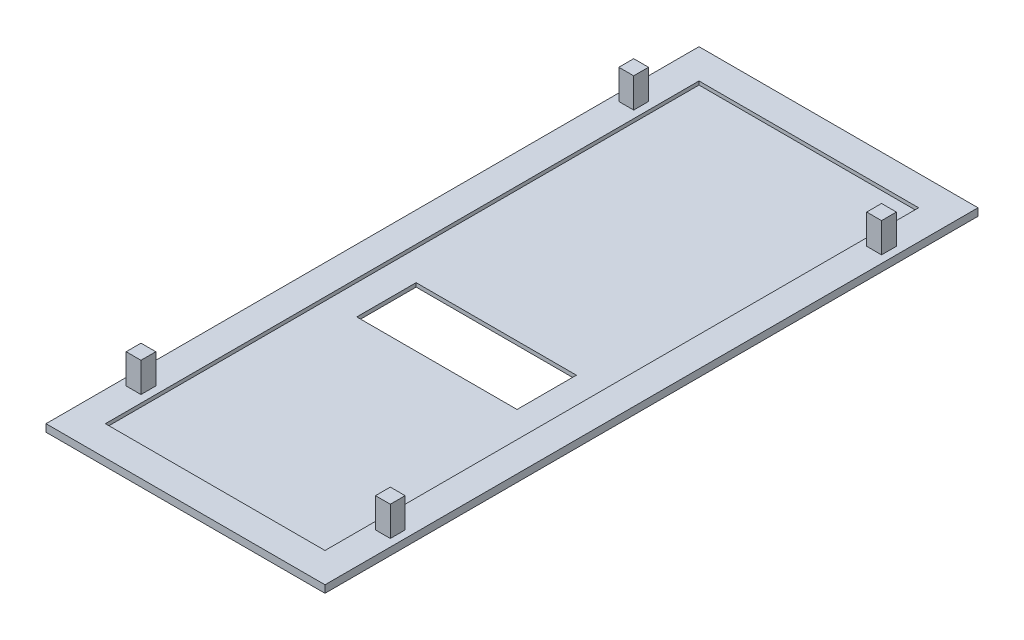
ISO-10303-21;
HEADER;
FILE_DESCRIPTION(('STEP AP214'),'2;1');
FILE_NAME('part.step','',(''),(''),'','','');
FILE_SCHEMA(('AUTOMOTIVE_DESIGN { 1 0 10303 214 1 1 1 1 }'));
ENDSEC;
DATA;
#1=APPLICATION_CONTEXT('core data for automotive mechanical design processes');
#2=APPLICATION_PROTOCOL_DEFINITION('international standard','automotive_design',2000,#1);
#3=PRODUCT_CONTEXT('',#1,'mechanical');
#4=PRODUCT('Part','Part','',(#3));
#5=PRODUCT_RELATED_PRODUCT_CATEGORY('part','',(#4));
#6=PRODUCT_DEFINITION_FORMATION('','',#4);
#7=PRODUCT_DEFINITION_CONTEXT('part definition',#1,'design');
#8=PRODUCT_DEFINITION('design','',#6,#7);
#9=PRODUCT_DEFINITION_SHAPE('','',#8);
#10=(LENGTH_UNIT() NAMED_UNIT(*) SI_UNIT(.MILLI.,.METRE.));
#11=(NAMED_UNIT(*) PLANE_ANGLE_UNIT() SI_UNIT($,.RADIAN.));
#12=(NAMED_UNIT(*) SI_UNIT($,.STERADIAN.) SOLID_ANGLE_UNIT());
#13=UNCERTAINTY_MEASURE_WITH_UNIT(LENGTH_MEASURE(1.E-05),#10,'distance_accuracy_value','');
#14=(GEOMETRIC_REPRESENTATION_CONTEXT(3) GLOBAL_UNCERTAINTY_ASSIGNED_CONTEXT((#13)) GLOBAL_UNIT_ASSIGNED_CONTEXT((#10,
#11,#12)) REPRESENTATION_CONTEXT('',''));
#15=CARTESIAN_POINT('',(0.,0.,0.));
#16=DIRECTION('',(0.,0.,1.));
#17=DIRECTION('',(1.,0.,0.));
#18=AXIS2_PLACEMENT_3D('',#15,#16,#17);
#19=CARTESIAN_POINT('',(10.,-3.75,-52.35));
#20=DIRECTION('',(-1.,0.,0.));
#21=DIRECTION('',(0.,0.,1.));
#22=AXIS2_PLACEMENT_3D('',#19,#20,#21);
#23=PLANE('',#22);
#24=DIRECTION('',(0.,0.,-1.));
#25=VECTOR('',#24,1.);
#26=CARTESIAN_POINT('',(10.,0.65,-52.35));
#27=LINE('',#26,#25);
#28=CARTESIAN_POINT('',(10.,0.65,-42.35));
#29=VERTEX_POINT('',#28);
#30=CARTESIAN_POINT('',(10.,0.65,-52.35));
#31=VERTEX_POINT('',#30);
#32=EDGE_CURVE('E258',#29,#31,#27,.T.);
#33=ORIENTED_EDGE('',*,*,#32,.F.);
#34=DIRECTION('',(0.,1.,0.));
#35=VECTOR('',#34,1.);
#36=CARTESIAN_POINT('',(10.,-3.75,-42.35));
#37=LINE('',#36,#35);
#38=CARTESIAN_POINT('',(10.,0.,-42.35));
#39=VERTEX_POINT('',#38);
#40=EDGE_CURVE('E260',#39,#29,#37,.T.);
#41=ORIENTED_EDGE('',*,*,#40,.F.);
#42=DIRECTION('',(0.,0.,-1.));
#43=VECTOR('',#42,1.);
#44=CARTESIAN_POINT('',(10.,0.,0.));
#45=LINE('',#44,#43);
#46=CARTESIAN_POINT('',(10.,0.,-52.35));
#47=VERTEX_POINT('',#46);
#48=EDGE_CURVE('E41',#39,#47,#45,.T.);
#49=ORIENTED_EDGE('',*,*,#48,.T.);
#50=DIRECTION('',(0.,1.,0.));
#51=VECTOR('',#50,1.);
#52=CARTESIAN_POINT('',(10.,-3.75,-52.35));
#53=LINE('',#52,#51);
#54=EDGE_CURVE('E261',#47,#31,#53,.T.);
#55=ORIENTED_EDGE('',*,*,#54,.T.);
#56=EDGE_LOOP('',(#33,#41,#49,#55));
#57=FACE_BOUND('',#56,.T.);
#58=ADVANCED_FACE('F33',(#57),#23,.F.);
#59=CARTESIAN_POINT('',(10.,-3.75,-52.35));
#60=DIRECTION('',(0.,0.,-1.));
#61=DIRECTION('',(-1.,0.,0.));
#62=AXIS2_PLACEMENT_3D('',#59,#60,#61);
#63=PLANE('',#62);
#64=DIRECTION('',(1.,0.,0.));
#65=VECTOR('',#64,1.);
#66=CARTESIAN_POINT('',(10.,0.65,-52.35));
#67=LINE('',#66,#65);
#68=CARTESIAN_POINT('',(37.,0.65,-52.35));
#69=VERTEX_POINT('',#68);
#70=EDGE_CURVE('E256',#31,#69,#67,.T.);
#71=ORIENTED_EDGE('',*,*,#70,.F.);
#72=ORIENTED_EDGE('',*,*,#54,.F.);
#73=DIRECTION('',(1.,0.,0.));
#74=VECTOR('',#73,1.);
#75=CARTESIAN_POINT('',(0.,0.,-52.35));
#76=LINE('',#75,#74);
#77=CARTESIAN_POINT('',(37.,0.,-52.35));
#78=VERTEX_POINT('',#77);
#79=EDGE_CURVE('E439',#47,#78,#76,.T.);
#80=ORIENTED_EDGE('',*,*,#79,.T.);
#81=DIRECTION('',(0.,1.,0.));
#82=VECTOR('',#81,1.);
#83=CARTESIAN_POINT('',(37.,-3.75,-52.35));
#84=LINE('',#83,#82);
#85=EDGE_CURVE('E265',#78,#69,#84,.T.);
#86=ORIENTED_EDGE('',*,*,#85,.T.);
#87=EDGE_LOOP('',(#71,#72,#80,#86));
#88=FACE_BOUND('',#87,.T.);
#89=ADVANCED_FACE('F450',(#88),#63,.F.);
#90=CARTESIAN_POINT('',(37.,-3.75,-52.35));
#91=DIRECTION('',(1.,0.,0.));
#92=DIRECTION('',(0.,0.,-1.));
#93=AXIS2_PLACEMENT_3D('',#90,#91,#92);
#94=PLANE('',#93);
#95=DIRECTION('',(0.,0.,1.));
#96=VECTOR('',#95,1.);
#97=CARTESIAN_POINT('',(37.,0.65,-52.35));
#98=LINE('',#97,#96);
#99=CARTESIAN_POINT('',(37.,0.65,-42.35));
#100=VERTEX_POINT('',#99);
#101=EDGE_CURVE('E55',#69,#100,#98,.T.);
#102=ORIENTED_EDGE('',*,*,#101,.F.);
#103=ORIENTED_EDGE('',*,*,#85,.F.);
#104=DIRECTION('',(0.,0.,1.));
#105=VECTOR('',#104,1.);
#106=CARTESIAN_POINT('',(37.,0.,0.));
#107=LINE('',#106,#105);
#108=CARTESIAN_POINT('',(37.,0.,-42.35));
#109=VERTEX_POINT('',#108);
#110=EDGE_CURVE('E436',#78,#109,#107,.T.);
#111=ORIENTED_EDGE('',*,*,#110,.T.);
#112=DIRECTION('',(0.,1.,0.));
#113=VECTOR('',#112,1.);
#114=CARTESIAN_POINT('',(37.,-3.75,-42.35));
#115=LINE('',#114,#113);
#116=EDGE_CURVE('E268',#109,#100,#115,.T.);
#117=ORIENTED_EDGE('',*,*,#116,.T.);
#118=EDGE_LOOP('',(#102,#103,#111,#117));
#119=FACE_BOUND('',#118,.T.);
#120=ADVANCED_FACE('F456',(#119),#94,.F.);
#121=CARTESIAN_POINT('',(10.,-3.75,-42.35));
#122=DIRECTION('',(0.,0.,1.));
#123=DIRECTION('',(1.,0.,0.));
#124=AXIS2_PLACEMENT_3D('',#121,#122,#123);
#125=PLANE('',#124);
#126=DIRECTION('',(-1.,0.,0.));
#127=VECTOR('',#126,1.);
#128=CARTESIAN_POINT('',(10.,0.65,-42.35));
#129=LINE('',#128,#127);
#130=EDGE_CURVE('E11',#100,#29,#129,.T.);
#131=ORIENTED_EDGE('',*,*,#130,.F.);
#132=ORIENTED_EDGE('',*,*,#116,.F.);
#133=DIRECTION('',(-1.,0.,0.));
#134=VECTOR('',#133,1.);
#135=CARTESIAN_POINT('',(0.,0.,-42.35));
#136=LINE('',#135,#134);
#137=EDGE_CURVE('E434',#109,#39,#136,.T.);
#138=ORIENTED_EDGE('',*,*,#137,.T.);
#139=ORIENTED_EDGE('',*,*,#40,.T.);
#140=EDGE_LOOP('',(#131,#132,#138,#139));
#141=FACE_BOUND('',#140,.T.);
#142=ADVANCED_FACE('F458',(#141),#125,.F.);
#143=CARTESIAN_POINT('',(0.,1.25,0.));
#144=DIRECTION('',(0.,-1.,0.));
#145=DIRECTION('',(0.,0.,-1.));
#146=AXIS2_PLACEMENT_3D('',#143,#144,#145);
#147=PLANE('',#146);
#148=DIRECTION('',(1.,0.,0.));
#149=VECTOR('',#148,1.);
#150=CARTESIAN_POINT('',(5.00000000000001,1.25,-5.));
#151=LINE('',#150,#149);
#152=CARTESIAN_POINT('',(5.00000000000001,1.25,-5.));
#153=VERTEX_POINT('',#152);
#154=CARTESIAN_POINT('',(42.,1.25,-5.));
#155=VERTEX_POINT('',#154);
#156=EDGE_CURVE('E246',#153,#155,#151,.T.);
#157=ORIENTED_EDGE('',*,*,#156,.F.);
#158=DIRECTION('',(0.,0.,1.));
#159=VECTOR('',#158,1.);
#160=CARTESIAN_POINT('',(5.,1.25,-105.));
#161=LINE('',#160,#159);
#162=CARTESIAN_POINT('',(5.,1.25,-105.));
#163=VERTEX_POINT('',#162);
#164=EDGE_CURVE('E48',#163,#153,#161,.T.);
#165=ORIENTED_EDGE('',*,*,#164,.F.);
#166=DIRECTION('',(-1.,0.,0.));
#167=VECTOR('',#166,1.);
#168=CARTESIAN_POINT('',(5.,1.25,-105.));
#169=LINE('',#168,#167);
#170=CARTESIAN_POINT('',(42.,1.25,-105.));
#171=VERTEX_POINT('',#170);
#172=EDGE_CURVE('E237',#171,#163,#169,.T.);
#173=ORIENTED_EDGE('',*,*,#172,.F.);
#174=DIRECTION('',(0.,0.,-1.));
#175=VECTOR('',#174,1.);
#176=CARTESIAN_POINT('',(42.,1.25,-105.));
#177=LINE('',#176,#175);
#178=EDGE_CURVE('E240',#155,#171,#177,.T.);
#179=ORIENTED_EDGE('',*,*,#178,.F.);
#180=EDGE_LOOP('',(#157,#165,#173,#179));
#181=FACE_BOUND('',#180,.T.);
#182=DIRECTION('',(0.,0.,1.));
#183=VECTOR('',#182,1.);
#184=CARTESIAN_POINT('',(1.25,1.25,-12.25));
#185=LINE('',#184,#183);
#186=CARTESIAN_POINT('',(1.25,1.25,-14.75));
#187=VERTEX_POINT('',#186);
#188=CARTESIAN_POINT('',(1.25,1.25,-12.25));
#189=VERTEX_POINT('',#188);
#190=EDGE_CURVE('E305',#187,#189,#185,.T.);
#191=ORIENTED_EDGE('',*,*,#190,.F.);
#192=DIRECTION('',(-1.,0.,0.));
#193=VECTOR('',#192,1.);
#194=CARTESIAN_POINT('',(1.25,1.25,-14.75));
#195=LINE('',#194,#193);
#196=CARTESIAN_POINT('',(3.75,1.25,-14.75));
#197=VERTEX_POINT('',#196);
#198=EDGE_CURVE('E310',#197,#187,#195,.T.);
#199=ORIENTED_EDGE('',*,*,#198,.F.);
#200=DIRECTION('',(0.,0.,-1.));
#201=VECTOR('',#200,1.);
#202=CARTESIAN_POINT('',(3.75,1.25,-12.25));
#203=LINE('',#202,#201);
#204=CARTESIAN_POINT('',(3.75,1.25,-12.25));
#205=VERTEX_POINT('',#204);
#206=EDGE_CURVE('E322',#205,#197,#203,.T.);
#207=ORIENTED_EDGE('',*,*,#206,.F.);
#208=DIRECTION('',(1.,0.,0.));
#209=VECTOR('',#208,1.);
#210=CARTESIAN_POINT('',(1.25,1.25,-12.25));
#211=LINE('',#210,#209);
#212=EDGE_CURVE('E319',#189,#205,#211,.T.);
#213=ORIENTED_EDGE('',*,*,#212,.F.);
#214=EDGE_LOOP('',(#191,#199,#207,#213));
#215=FACE_BOUND('',#214,.T.);
#216=DIRECTION('',(0.,0.,1.));
#217=VECTOR('',#216,1.);
#218=CARTESIAN_POINT('',(43.25,1.25,-97.5));
#219=LINE('',#218,#217);
#220=CARTESIAN_POINT('',(43.25,1.25,-97.5));
#221=VERTEX_POINT('',#220);
#222=CARTESIAN_POINT('',(43.25,1.25,-95.));
#223=VERTEX_POINT('',#222);
#224=EDGE_CURVE('E371',#221,#223,#219,.T.);
#225=ORIENTED_EDGE('',*,*,#224,.F.);
#226=DIRECTION('',(-1.,0.,0.));
#227=VECTOR('',#226,1.);
#228=CARTESIAN_POINT('',(43.25,1.25,-97.5));
#229=LINE('',#228,#227);
#230=CARTESIAN_POINT('',(45.75,1.25,-97.5));
#231=VERTEX_POINT('',#230);
#232=EDGE_CURVE('E376',#231,#221,#229,.T.);
#233=ORIENTED_EDGE('',*,*,#232,.F.);
#234=DIRECTION('',(0.,0.,-1.));
#235=VECTOR('',#234,1.);
#236=CARTESIAN_POINT('',(45.75,1.25,-97.5));
#237=LINE('',#236,#235);
#238=CARTESIAN_POINT('',(45.75,1.25,-95.));
#239=VERTEX_POINT('',#238);
#240=EDGE_CURVE('E388',#239,#231,#237,.T.);
#241=ORIENTED_EDGE('',*,*,#240,.F.);
#242=DIRECTION('',(1.,0.,0.));
#243=VECTOR('',#242,1.);
#244=CARTESIAN_POINT('',(43.25,1.25,-95.));
#245=LINE('',#244,#243);
#246=EDGE_CURVE('E385',#223,#239,#245,.T.);
#247=ORIENTED_EDGE('',*,*,#246,.F.);
#248=EDGE_LOOP('',(#225,#233,#241,#247));
#249=FACE_BOUND('',#248,.T.);
#250=DIRECTION('',(0.,0.,1.));
#251=VECTOR('',#250,1.);
#252=CARTESIAN_POINT('',(0.,1.25,0.));
#253=LINE('',#252,#251);
#254=CARTESIAN_POINT('',(0.,1.25,-110.));
#255=VERTEX_POINT('',#254);
#256=CARTESIAN_POINT('',(0.,1.25,0.));
#257=VERTEX_POINT('',#256);
#258=EDGE_CURVE('E405',#255,#257,#253,.T.);
#259=ORIENTED_EDGE('',*,*,#258,.T.);
#260=DIRECTION('',(1.,0.,0.));
#261=VECTOR('',#260,1.);
#262=CARTESIAN_POINT('',(0.,1.25,0.));
#263=LINE('',#262,#261);
#264=CARTESIAN_POINT('',(47.,1.25,0.));
#265=VERTEX_POINT('',#264);
#266=EDGE_CURVE('E408',#257,#265,#263,.T.);
#267=ORIENTED_EDGE('',*,*,#266,.T.);
#268=DIRECTION('',(0.,0.,-1.));
#269=VECTOR('',#268,1.);
#270=CARTESIAN_POINT('',(47.,1.25,0.));
#271=LINE('',#270,#269);
#272=CARTESIAN_POINT('',(47.,1.25,-110.));
#273=VERTEX_POINT('',#272);
#274=EDGE_CURVE('E411',#265,#273,#271,.T.);
#275=ORIENTED_EDGE('',*,*,#274,.T.);
#276=DIRECTION('',(-1.,0.,0.));
#277=VECTOR('',#276,1.);
#278=CARTESIAN_POINT('',(0.,1.25,-110.));
#279=LINE('',#278,#277);
#280=EDGE_CURVE('E413',#273,#255,#279,.T.);
#281=ORIENTED_EDGE('',*,*,#280,.T.);
#282=EDGE_LOOP('',(#259,#267,#275,#281));
#283=FACE_BOUND('',#282,.T.);
#284=DIRECTION('',(0.,0.,-1.));
#285=VECTOR('',#284,1.);
#286=CARTESIAN_POINT('',(45.75,1.25,-14.75));
#287=LINE('',#286,#285);
#288=CARTESIAN_POINT('',(45.75,1.25,-12.25));
#289=VERTEX_POINT('',#288);
#290=CARTESIAN_POINT('',(45.75,1.25,-14.75));
#291=VERTEX_POINT('',#290);
#292=EDGE_CURVE('E338',#289,#291,#287,.T.);
#293=ORIENTED_EDGE('',*,*,#292,.F.);
#294=DIRECTION('',(1.,0.,0.));
#295=VECTOR('',#294,1.);
#296=CARTESIAN_POINT('',(45.75,1.25,-12.25));
#297=LINE('',#296,#295);
#298=CARTESIAN_POINT('',(43.25,1.25,-12.25));
#299=VERTEX_POINT('',#298);
#300=EDGE_CURVE('E343',#299,#289,#297,.T.);
#301=ORIENTED_EDGE('',*,*,#300,.F.);
#302=DIRECTION('',(0.,0.,1.));
#303=VECTOR('',#302,1.);
#304=CARTESIAN_POINT('',(43.25,1.25,-14.75));
#305=LINE('',#304,#303);
#306=CARTESIAN_POINT('',(43.25,1.25,-14.75));
#307=VERTEX_POINT('',#306);
#308=EDGE_CURVE('E355',#307,#299,#305,.T.);
#309=ORIENTED_EDGE('',*,*,#308,.F.);
#310=DIRECTION('',(-1.,0.,0.));
#311=VECTOR('',#310,1.);
#312=CARTESIAN_POINT('',(45.75,1.25,-14.75));
#313=LINE('',#312,#311);
#314=EDGE_CURVE('E352',#291,#307,#313,.T.);
#315=ORIENTED_EDGE('',*,*,#314,.F.);
#316=EDGE_LOOP('',(#293,#301,#309,#315));
#317=FACE_BOUND('',#316,.T.);
#318=DIRECTION('',(0.,0.,1.));
#319=VECTOR('',#318,1.);
#320=CARTESIAN_POINT('',(1.25,1.25,-97.75));
#321=LINE('',#320,#319);
#322=CARTESIAN_POINT('',(1.25,1.25,-97.75));
#323=VERTEX_POINT('',#322);
#324=CARTESIAN_POINT('',(1.25,1.25,-95.25));
#325=VERTEX_POINT('',#324);
#326=EDGE_CURVE('E264',#323,#325,#321,.T.);
#327=ORIENTED_EDGE('',*,*,#326,.F.);
#328=DIRECTION('',(-1.,0.,0.));
#329=VECTOR('',#328,1.);
#330=CARTESIAN_POINT('',(1.25,1.25,-97.75));
#331=LINE('',#330,#329);
#332=CARTESIAN_POINT('',(3.75,1.25,-97.75));
#333=VERTEX_POINT('',#332);
#334=EDGE_CURVE('E277',#333,#323,#331,.T.);
#335=ORIENTED_EDGE('',*,*,#334,.F.);
#336=DIRECTION('',(0.,0.,-1.));
#337=VECTOR('',#336,1.);
#338=CARTESIAN_POINT('',(3.75,1.25,-97.75));
#339=LINE('',#338,#337);
#340=CARTESIAN_POINT('',(3.75,1.25,-95.25));
#341=VERTEX_POINT('',#340);
#342=EDGE_CURVE('E289',#341,#333,#339,.T.);
#343=ORIENTED_EDGE('',*,*,#342,.F.);
#344=DIRECTION('',(1.,0.,0.));
#345=VECTOR('',#344,1.);
#346=CARTESIAN_POINT('',(1.25,1.25,-95.25));
#347=LINE('',#346,#345);
#348=EDGE_CURVE('E286',#325,#341,#347,.T.);
#349=ORIENTED_EDGE('',*,*,#348,.F.);
#350=EDGE_LOOP('',(#327,#335,#343,#349));
#351=FACE_BOUND('',#350,.T.);
#352=ADVANCED_FACE('F557',(#181,#215,#249,#283,#317,#351),#147,.F.);
#353=CARTESIAN_POINT('',(0.,1.25,0.));
#354=DIRECTION('',(1.,0.,0.));
#355=DIRECTION('',(0.,0.,-1.));
#356=AXIS2_PLACEMENT_3D('',#353,#354,#355);
#357=PLANE('',#356);
#358=DIRECTION('',(0.,0.,1.));
#359=VECTOR('',#358,1.);
#360=CARTESIAN_POINT('',(0.,0.,0.));
#361=LINE('',#360,#359);
#362=CARTESIAN_POINT('',(0.,0.,-110.));
#363=VERTEX_POINT('',#362);
#364=CARTESIAN_POINT('',(0.,0.,0.));
#365=VERTEX_POINT('',#364);
#366=EDGE_CURVE('E404',#363,#365,#361,.T.);
#367=ORIENTED_EDGE('',*,*,#366,.T.);
#368=DIRECTION('',(0.,-1.,0.));
#369=VECTOR('',#368,1.);
#370=CARTESIAN_POINT('',(0.,1.25,0.));
#371=LINE('',#370,#369);
#372=EDGE_CURVE('E431',#257,#365,#371,.T.);
#373=ORIENTED_EDGE('',*,*,#372,.F.);
#374=ORIENTED_EDGE('',*,*,#258,.F.);
#375=DIRECTION('',(0.,-1.,0.));
#376=VECTOR('',#375,1.);
#377=CARTESIAN_POINT('',(0.,1.25,-110.));
#378=LINE('',#377,#376);
#379=EDGE_CURVE('E415',#255,#363,#378,.T.);
#380=ORIENTED_EDGE('',*,*,#379,.T.);
#381=EDGE_LOOP('',(#367,#373,#374,#380));
#382=FACE_BOUND('',#381,.T.);
#383=ADVANCED_FACE('F35',(#382),#357,.F.);
#384=CARTESIAN_POINT('',(0.,1.25,0.));
#385=DIRECTION('',(0.,0.,-1.));
#386=DIRECTION('',(-1.,0.,0.));
#387=AXIS2_PLACEMENT_3D('',#384,#385,#386);
#388=PLANE('',#387);
#389=DIRECTION('',(1.,0.,0.));
#390=VECTOR('',#389,1.);
#391=CARTESIAN_POINT('',(0.,0.,0.));
#392=LINE('',#391,#390);
#393=CARTESIAN_POINT('',(47.,0.,0.));
#394=VERTEX_POINT('',#393);
#395=EDGE_CURVE('E418',#365,#394,#392,.T.);
#396=ORIENTED_EDGE('',*,*,#395,.T.);
#397=DIRECTION('',(0.,-1.,0.));
#398=VECTOR('',#397,1.);
#399=CARTESIAN_POINT('',(47.,1.25,0.));
#400=LINE('',#399,#398);
#401=EDGE_CURVE('E428',#265,#394,#400,.T.);
#402=ORIENTED_EDGE('',*,*,#401,.F.);
#403=ORIENTED_EDGE('',*,*,#266,.F.);
#404=ORIENTED_EDGE('',*,*,#372,.T.);
#405=EDGE_LOOP('',(#396,#402,#403,#404));
#406=FACE_BOUND('',#405,.T.);
#407=ADVANCED_FACE('F569',(#406),#388,.F.);
#408=CARTESIAN_POINT('',(47.,1.25,0.));
#409=DIRECTION('',(-1.,0.,0.));
#410=DIRECTION('',(0.,0.,1.));
#411=AXIS2_PLACEMENT_3D('',#408,#409,#410);
#412=PLANE('',#411);
#413=DIRECTION('',(0.,0.,-1.));
#414=VECTOR('',#413,1.);
#415=CARTESIAN_POINT('',(47.,0.,0.));
#416=LINE('',#415,#414);
#417=CARTESIAN_POINT('',(47.,0.,-110.));
#418=VERTEX_POINT('',#417);
#419=EDGE_CURVE('E420',#394,#418,#416,.T.);
#420=ORIENTED_EDGE('',*,*,#419,.T.);
#421=DIRECTION('',(0.,-1.,0.));
#422=VECTOR('',#421,1.);
#423=CARTESIAN_POINT('',(47.,1.25,-110.));
#424=LINE('',#423,#422);
#425=EDGE_CURVE('E425',#273,#418,#424,.T.);
#426=ORIENTED_EDGE('',*,*,#425,.F.);
#427=ORIENTED_EDGE('',*,*,#274,.F.);
#428=ORIENTED_EDGE('',*,*,#401,.T.);
#429=EDGE_LOOP('',(#420,#426,#427,#428));
#430=FACE_BOUND('',#429,.T.);
#431=ADVANCED_FACE('F566',(#430),#412,.F.);
#432=CARTESIAN_POINT('',(0.,1.25,-110.));
#433=DIRECTION('',(0.,0.,1.));
#434=DIRECTION('',(1.,0.,0.));
#435=AXIS2_PLACEMENT_3D('',#432,#433,#434);
#436=PLANE('',#435);
#437=DIRECTION('',(-1.,0.,0.));
#438=VECTOR('',#437,1.);
#439=CARTESIAN_POINT('',(0.,0.,-110.));
#440=LINE('',#439,#438);
#441=EDGE_CURVE('E409',#418,#363,#440,.T.);
#442=ORIENTED_EDGE('',*,*,#441,.T.);
#443=ORIENTED_EDGE('',*,*,#379,.F.);
#444=ORIENTED_EDGE('',*,*,#280,.F.);
#445=ORIENTED_EDGE('',*,*,#425,.T.);
#446=EDGE_LOOP('',(#442,#443,#444,#445));
#447=FACE_BOUND('',#446,.T.);
#448=ADVANCED_FACE('F563',(#447),#436,.F.);
#449=CARTESIAN_POINT('',(0.,0.,0.));
#450=DIRECTION('',(0.,-1.,0.));
#451=DIRECTION('',(0.,0.,-1.));
#452=AXIS2_PLACEMENT_3D('',#449,#450,#451);
#453=PLANE('',#452);
#454=ORIENTED_EDGE('',*,*,#48,.F.);
#455=ORIENTED_EDGE('',*,*,#137,.F.);
#456=ORIENTED_EDGE('',*,*,#110,.F.);
#457=ORIENTED_EDGE('',*,*,#79,.F.);
#458=EDGE_LOOP('',(#454,#455,#456,#457));
#459=FACE_BOUND('',#458,.T.);
#460=ORIENTED_EDGE('',*,*,#366,.F.);
#461=ORIENTED_EDGE('',*,*,#441,.F.);
#462=ORIENTED_EDGE('',*,*,#419,.F.);
#463=ORIENTED_EDGE('',*,*,#395,.F.);
#464=EDGE_LOOP('',(#460,#461,#462,#463));
#465=FACE_BOUND('',#464,.T.);
#466=ADVANCED_FACE('F453',(#459,#465),#453,.T.);
#467=CARTESIAN_POINT('',(43.25,6.25,-97.5));
#468=DIRECTION('',(1.,0.,0.));
#469=DIRECTION('',(0.,0.,-1.));
#470=AXIS2_PLACEMENT_3D('',#467,#468,#469);
#471=PLANE('',#470);
#472=ORIENTED_EDGE('',*,*,#224,.T.);
#473=DIRECTION('',(0.,-1.,0.));
#474=VECTOR('',#473,1.);
#475=CARTESIAN_POINT('',(43.25,6.25,-95.));
#476=LINE('',#475,#474);
#477=CARTESIAN_POINT('',(43.25,6.25,-95.));
#478=VERTEX_POINT('',#477);
#479=EDGE_CURVE('E401',#478,#223,#476,.T.);
#480=ORIENTED_EDGE('',*,*,#479,.F.);
#481=DIRECTION('',(0.,0.,1.));
#482=VECTOR('',#481,1.);
#483=CARTESIAN_POINT('',(43.25,6.25,-97.5));
#484=LINE('',#483,#482);
#485=CARTESIAN_POINT('',(43.25,6.25,-97.5));
#486=VERTEX_POINT('',#485);
#487=EDGE_CURVE('E372',#486,#478,#484,.T.);
#488=ORIENTED_EDGE('',*,*,#487,.F.);
#489=DIRECTION('',(0.,-1.,0.));
#490=VECTOR('',#489,1.);
#491=CARTESIAN_POINT('',(43.25,6.25,-97.5));
#492=LINE('',#491,#490);
#493=EDGE_CURVE('E382',#486,#221,#492,.T.);
#494=ORIENTED_EDGE('',*,*,#493,.T.);
#495=EDGE_LOOP('',(#472,#480,#488,#494));
#496=FACE_BOUND('',#495,.T.);
#497=ADVANCED_FACE('F552',(#496),#471,.F.);
#498=CARTESIAN_POINT('',(43.25,6.25,-95.));
#499=DIRECTION('',(0.,0.,-1.));
#500=DIRECTION('',(-1.,0.,0.));
#501=AXIS2_PLACEMENT_3D('',#498,#499,#500);
#502=PLANE('',#501);
#503=ORIENTED_EDGE('',*,*,#246,.T.);
#504=DIRECTION('',(0.,-1.,0.));
#505=VECTOR('',#504,1.);
#506=CARTESIAN_POINT('',(45.75,6.25,-95.));
#507=LINE('',#506,#505);
#508=CARTESIAN_POINT('',(45.75,6.25,-95.));
#509=VERTEX_POINT('',#508);
#510=EDGE_CURVE('E398',#509,#239,#507,.T.);
#511=ORIENTED_EDGE('',*,*,#510,.F.);
#512=DIRECTION('',(1.,0.,0.));
#513=VECTOR('',#512,1.);
#514=CARTESIAN_POINT('',(43.25,6.25,-95.));
#515=LINE('',#514,#513);
#516=EDGE_CURVE('E375',#478,#509,#515,.T.);
#517=ORIENTED_EDGE('',*,*,#516,.F.);
#518=ORIENTED_EDGE('',*,*,#479,.T.);
#519=EDGE_LOOP('',(#503,#511,#517,#518));
#520=FACE_BOUND('',#519,.T.);
#521=ADVANCED_FACE('F548',(#520),#502,.F.);
#522=CARTESIAN_POINT('',(45.75,6.25,-97.5));
#523=DIRECTION('',(-1.,0.,0.));
#524=DIRECTION('',(0.,0.,1.));
#525=AXIS2_PLACEMENT_3D('',#522,#523,#524);
#526=PLANE('',#525);
#527=ORIENTED_EDGE('',*,*,#240,.T.);
#528=DIRECTION('',(0.,-1.,0.));
#529=VECTOR('',#528,1.);
#530=CARTESIAN_POINT('',(45.75,6.25,-97.5));
#531=LINE('',#530,#529);
#532=CARTESIAN_POINT('',(45.75,6.25,-97.5));
#533=VERTEX_POINT('',#532);
#534=EDGE_CURVE('E395',#533,#231,#531,.T.);
#535=ORIENTED_EDGE('',*,*,#534,.F.);
#536=DIRECTION('',(0.,0.,-1.));
#537=VECTOR('',#536,1.);
#538=CARTESIAN_POINT('',(45.75,6.25,-97.5));
#539=LINE('',#538,#537);
#540=EDGE_CURVE('E378',#509,#533,#539,.T.);
#541=ORIENTED_EDGE('',*,*,#540,.F.);
#542=ORIENTED_EDGE('',*,*,#510,.T.);
#543=EDGE_LOOP('',(#527,#535,#541,#542));
#544=FACE_BOUND('',#543,.T.);
#545=ADVANCED_FACE('F544',(#544),#526,.F.);
#546=CARTESIAN_POINT('',(43.25,6.25,-97.5));
#547=DIRECTION('',(0.,0.,1.));
#548=DIRECTION('',(1.,0.,0.));
#549=AXIS2_PLACEMENT_3D('',#546,#547,#548);
#550=PLANE('',#549);
#551=ORIENTED_EDGE('',*,*,#232,.T.);
#552=ORIENTED_EDGE('',*,*,#493,.F.);
#553=DIRECTION('',(-1.,0.,0.));
#554=VECTOR('',#553,1.);
#555=CARTESIAN_POINT('',(43.25,6.25,-97.5));
#556=LINE('',#555,#554);
#557=EDGE_CURVE('E380',#533,#486,#556,.T.);
#558=ORIENTED_EDGE('',*,*,#557,.F.);
#559=ORIENTED_EDGE('',*,*,#534,.T.);
#560=EDGE_LOOP('',(#551,#552,#558,#559));
#561=FACE_BOUND('',#560,.T.);
#562=ADVANCED_FACE('F540',(#561),#550,.F.);
#563=CARTESIAN_POINT('',(0.,6.25,0.));
#564=DIRECTION('',(0.,1.,0.));
#565=DIRECTION('',(0.,0.,1.));
#566=AXIS2_PLACEMENT_3D('',#563,#564,#565);
#567=PLANE('',#566);
#568=ORIENTED_EDGE('',*,*,#487,.T.);
#569=ORIENTED_EDGE('',*,*,#516,.T.);
#570=ORIENTED_EDGE('',*,*,#540,.T.);
#571=ORIENTED_EDGE('',*,*,#557,.T.);
#572=EDGE_LOOP('',(#568,#569,#570,#571));
#573=FACE_BOUND('',#572,.T.);
#574=ADVANCED_FACE('F536',(#573),#567,.T.);
#575=CARTESIAN_POINT('',(45.75,6.25,-14.75));
#576=DIRECTION('',(-1.,0.,0.));
#577=DIRECTION('',(0.,0.,1.));
#578=AXIS2_PLACEMENT_3D('',#575,#576,#577);
#579=PLANE('',#578);
#580=ORIENTED_EDGE('',*,*,#292,.T.);
#581=DIRECTION('',(0.,-1.,0.));
#582=VECTOR('',#581,1.);
#583=CARTESIAN_POINT('',(45.75,6.25,-14.75));
#584=LINE('',#583,#582);
#585=CARTESIAN_POINT('',(45.75,6.25,-14.75));
#586=VERTEX_POINT('',#585);
#587=EDGE_CURVE('E368',#586,#291,#584,.T.);
#588=ORIENTED_EDGE('',*,*,#587,.F.);
#589=DIRECTION('',(0.,0.,-1.));
#590=VECTOR('',#589,1.);
#591=CARTESIAN_POINT('',(45.75,6.25,-14.75));
#592=LINE('',#591,#590);
#593=CARTESIAN_POINT('',(45.75,6.25,-12.25));
#594=VERTEX_POINT('',#593);
#595=EDGE_CURVE('E339',#594,#586,#592,.T.);
#596=ORIENTED_EDGE('',*,*,#595,.F.);
#597=DIRECTION('',(0.,-1.,0.));
#598=VECTOR('',#597,1.);
#599=CARTESIAN_POINT('',(45.75,6.25,-12.25));
#600=LINE('',#599,#598);
#601=EDGE_CURVE('E349',#594,#289,#600,.T.);
#602=ORIENTED_EDGE('',*,*,#601,.T.);
#603=EDGE_LOOP('',(#580,#588,#596,#602));
#604=FACE_BOUND('',#603,.T.);
#605=ADVANCED_FACE('F532',(#604),#579,.F.);
#606=CARTESIAN_POINT('',(45.75,6.25,-14.75));
#607=DIRECTION('',(0.,0.,1.));
#608=DIRECTION('',(1.,0.,0.));
#609=AXIS2_PLACEMENT_3D('',#606,#607,#608);
#610=PLANE('',#609);
#611=ORIENTED_EDGE('',*,*,#314,.T.);
#612=DIRECTION('',(0.,-1.,0.));
#613=VECTOR('',#612,1.);
#614=CARTESIAN_POINT('',(43.25,6.25,-14.75));
#615=LINE('',#614,#613);
#616=CARTESIAN_POINT('',(43.25,6.25,-14.75));
#617=VERTEX_POINT('',#616);
#618=EDGE_CURVE('E365',#617,#307,#615,.T.);
#619=ORIENTED_EDGE('',*,*,#618,.F.);
#620=DIRECTION('',(-1.,0.,0.));
#621=VECTOR('',#620,1.);
#622=CARTESIAN_POINT('',(45.75,6.25,-14.75));
#623=LINE('',#622,#621);
#624=EDGE_CURVE('E342',#586,#617,#623,.T.);
#625=ORIENTED_EDGE('',*,*,#624,.F.);
#626=ORIENTED_EDGE('',*,*,#587,.T.);
#627=EDGE_LOOP('',(#611,#619,#625,#626));
#628=FACE_BOUND('',#627,.T.);
#629=ADVANCED_FACE('F528',(#628),#610,.F.);
#630=CARTESIAN_POINT('',(43.25,6.25,-14.75));
#631=DIRECTION('',(1.,0.,0.));
#632=DIRECTION('',(0.,0.,-1.));
#633=AXIS2_PLACEMENT_3D('',#630,#631,#632);
#634=PLANE('',#633);
#635=ORIENTED_EDGE('',*,*,#308,.T.);
#636=DIRECTION('',(0.,-1.,0.));
#637=VECTOR('',#636,1.);
#638=CARTESIAN_POINT('',(43.25,6.25,-12.25));
#639=LINE('',#638,#637);
#640=CARTESIAN_POINT('',(43.25,6.25,-12.25));
#641=VERTEX_POINT('',#640);
#642=EDGE_CURVE('E362',#641,#299,#639,.T.);
#643=ORIENTED_EDGE('',*,*,#642,.F.);
#644=DIRECTION('',(0.,0.,1.));
#645=VECTOR('',#644,1.);
#646=CARTESIAN_POINT('',(43.25,6.25,-14.75));
#647=LINE('',#646,#645);
#648=EDGE_CURVE('E345',#617,#641,#647,.T.);
#649=ORIENTED_EDGE('',*,*,#648,.F.);
#650=ORIENTED_EDGE('',*,*,#618,.T.);
#651=EDGE_LOOP('',(#635,#643,#649,#650));
#652=FACE_BOUND('',#651,.T.);
#653=ADVANCED_FACE('F524',(#652),#634,.F.);
#654=CARTESIAN_POINT('',(45.75,6.25,-12.25));
#655=DIRECTION('',(0.,0.,-1.));
#656=DIRECTION('',(-1.,0.,0.));
#657=AXIS2_PLACEMENT_3D('',#654,#655,#656);
#658=PLANE('',#657);
#659=ORIENTED_EDGE('',*,*,#300,.T.);
#660=ORIENTED_EDGE('',*,*,#601,.F.);
#661=DIRECTION('',(1.,0.,0.));
#662=VECTOR('',#661,1.);
#663=CARTESIAN_POINT('',(45.75,6.25,-12.25));
#664=LINE('',#663,#662);
#665=EDGE_CURVE('E347',#641,#594,#664,.T.);
#666=ORIENTED_EDGE('',*,*,#665,.F.);
#667=ORIENTED_EDGE('',*,*,#642,.T.);
#668=EDGE_LOOP('',(#659,#660,#666,#667));
#669=FACE_BOUND('',#668,.T.);
#670=ADVANCED_FACE('F520',(#669),#658,.F.);
#671=CARTESIAN_POINT('',(0.,6.25,0.));
#672=DIRECTION('',(0.,-1.,0.));
#673=DIRECTION('',(0.,0.,-1.));
#674=AXIS2_PLACEMENT_3D('',#671,#672,#673);
#675=PLANE('',#674);
#676=ORIENTED_EDGE('',*,*,#595,.T.);
#677=ORIENTED_EDGE('',*,*,#624,.T.);
#678=ORIENTED_EDGE('',*,*,#648,.T.);
#679=ORIENTED_EDGE('',*,*,#665,.T.);
#680=EDGE_LOOP('',(#676,#677,#678,#679));
#681=FACE_BOUND('',#680,.T.);
#682=ADVANCED_FACE('F516',(#681),#675,.F.);
#683=CARTESIAN_POINT('',(1.25,6.25,-12.25));
#684=DIRECTION('',(1.,0.,0.));
#685=DIRECTION('',(0.,0.,-1.));
#686=AXIS2_PLACEMENT_3D('',#683,#684,#685);
#687=PLANE('',#686);
#688=ORIENTED_EDGE('',*,*,#190,.T.);
#689=DIRECTION('',(0.,-1.,0.));
#690=VECTOR('',#689,1.);
#691=CARTESIAN_POINT('',(1.25,6.25,-12.25));
#692=LINE('',#691,#690);
#693=CARTESIAN_POINT('',(1.25,6.25,-12.25));
#694=VERTEX_POINT('',#693);
#695=EDGE_CURVE('E335',#694,#189,#692,.T.);
#696=ORIENTED_EDGE('',*,*,#695,.F.);
#697=DIRECTION('',(0.,0.,1.));
#698=VECTOR('',#697,1.);
#699=CARTESIAN_POINT('',(1.25,6.25,-12.25));
#700=LINE('',#699,#698);
#701=CARTESIAN_POINT('',(1.25,6.25,-14.75));
#702=VERTEX_POINT('',#701);
#703=EDGE_CURVE('E306',#702,#694,#700,.T.);
#704=ORIENTED_EDGE('',*,*,#703,.F.);
#705=DIRECTION('',(0.,-1.,0.));
#706=VECTOR('',#705,1.);
#707=CARTESIAN_POINT('',(1.25,6.25,-14.75));
#708=LINE('',#707,#706);
#709=EDGE_CURVE('E316',#702,#187,#708,.T.);
#710=ORIENTED_EDGE('',*,*,#709,.T.);
#711=EDGE_LOOP('',(#688,#696,#704,#710));
#712=FACE_BOUND('',#711,.T.);
#713=ADVANCED_FACE('F512',(#712),#687,.F.);
#714=CARTESIAN_POINT('',(1.25,6.25,-12.25));
#715=DIRECTION('',(0.,0.,-1.));
#716=DIRECTION('',(-1.,0.,0.));
#717=AXIS2_PLACEMENT_3D('',#714,#715,#716);
#718=PLANE('',#717);
#719=ORIENTED_EDGE('',*,*,#212,.T.);
#720=DIRECTION('',(0.,-1.,0.));
#721=VECTOR('',#720,1.);
#722=CARTESIAN_POINT('',(3.75,6.25,-12.25));
#723=LINE('',#722,#721);
#724=CARTESIAN_POINT('',(3.75,6.25,-12.25));
#725=VERTEX_POINT('',#724);
#726=EDGE_CURVE('E332',#725,#205,#723,.T.);
#727=ORIENTED_EDGE('',*,*,#726,.F.);
#728=DIRECTION('',(1.,0.,0.));
#729=VECTOR('',#728,1.);
#730=CARTESIAN_POINT('',(1.25,6.25,-12.25));
#731=LINE('',#730,#729);
#732=EDGE_CURVE('E309',#694,#725,#731,.T.);
#733=ORIENTED_EDGE('',*,*,#732,.F.);
#734=ORIENTED_EDGE('',*,*,#695,.T.);
#735=EDGE_LOOP('',(#719,#727,#733,#734));
#736=FACE_BOUND('',#735,.T.);
#737=ADVANCED_FACE('F508',(#736),#718,.F.);
#738=CARTESIAN_POINT('',(3.75,6.25,-12.25));
#739=DIRECTION('',(-1.,0.,0.));
#740=DIRECTION('',(0.,0.,1.));
#741=AXIS2_PLACEMENT_3D('',#738,#739,#740);
#742=PLANE('',#741);
#743=ORIENTED_EDGE('',*,*,#206,.T.);
#744=DIRECTION('',(0.,-1.,0.));
#745=VECTOR('',#744,1.);
#746=CARTESIAN_POINT('',(3.75,6.25,-14.75));
#747=LINE('',#746,#745);
#748=CARTESIAN_POINT('',(3.75,6.25,-14.75));
#749=VERTEX_POINT('',#748);
#750=EDGE_CURVE('E329',#749,#197,#747,.T.);
#751=ORIENTED_EDGE('',*,*,#750,.F.);
#752=DIRECTION('',(0.,0.,-1.));
#753=VECTOR('',#752,1.);
#754=CARTESIAN_POINT('',(3.75,6.25,-12.25));
#755=LINE('',#754,#753);
#756=EDGE_CURVE('E312',#725,#749,#755,.T.);
#757=ORIENTED_EDGE('',*,*,#756,.F.);
#758=ORIENTED_EDGE('',*,*,#726,.T.);
#759=EDGE_LOOP('',(#743,#751,#757,#758));
#760=FACE_BOUND('',#759,.T.);
#761=ADVANCED_FACE('F504',(#760),#742,.F.);
#762=CARTESIAN_POINT('',(1.25,6.25,-14.75));
#763=DIRECTION('',(0.,0.,1.));
#764=DIRECTION('',(1.,0.,0.));
#765=AXIS2_PLACEMENT_3D('',#762,#763,#764);
#766=PLANE('',#765);
#767=ORIENTED_EDGE('',*,*,#198,.T.);
#768=ORIENTED_EDGE('',*,*,#709,.F.);
#769=DIRECTION('',(-1.,0.,0.));
#770=VECTOR('',#769,1.);
#771=CARTESIAN_POINT('',(1.25,6.25,-14.75));
#772=LINE('',#771,#770);
#773=EDGE_CURVE('E314',#749,#702,#772,.T.);
#774=ORIENTED_EDGE('',*,*,#773,.F.);
#775=ORIENTED_EDGE('',*,*,#750,.T.);
#776=EDGE_LOOP('',(#767,#768,#774,#775));
#777=FACE_BOUND('',#776,.T.);
#778=ADVANCED_FACE('F500',(#777),#766,.F.);
#779=CARTESIAN_POINT('',(0.,6.25,0.));
#780=DIRECTION('',(0.,-1.,0.));
#781=DIRECTION('',(0.,0.,-1.));
#782=AXIS2_PLACEMENT_3D('',#779,#780,#781);
#783=PLANE('',#782);
#784=ORIENTED_EDGE('',*,*,#703,.T.);
#785=ORIENTED_EDGE('',*,*,#732,.T.);
#786=ORIENTED_EDGE('',*,*,#756,.T.);
#787=ORIENTED_EDGE('',*,*,#773,.T.);
#788=EDGE_LOOP('',(#784,#785,#786,#787));
#789=FACE_BOUND('',#788,.T.);
#790=ADVANCED_FACE('F496',(#789),#783,.F.);
#791=CARTESIAN_POINT('',(1.25,6.25,-97.75));
#792=DIRECTION('',(1.,0.,0.));
#793=DIRECTION('',(0.,0.,-1.));
#794=AXIS2_PLACEMENT_3D('',#791,#792,#793);
#795=PLANE('',#794);
#796=ORIENTED_EDGE('',*,*,#326,.T.);
#797=DIRECTION('',(0.,-1.,0.));
#798=VECTOR('',#797,1.);
#799=CARTESIAN_POINT('',(1.25,6.25,-95.25));
#800=LINE('',#799,#798);
#801=CARTESIAN_POINT('',(1.25,6.25,-95.25));
#802=VERTEX_POINT('',#801);
#803=EDGE_CURVE('E302',#802,#325,#800,.T.);
#804=ORIENTED_EDGE('',*,*,#803,.F.);
#805=DIRECTION('',(0.,0.,1.));
#806=VECTOR('',#805,1.);
#807=CARTESIAN_POINT('',(1.25,6.25,-97.75));
#808=LINE('',#807,#806);
#809=CARTESIAN_POINT('',(1.25,6.25,-97.75));
#810=VERTEX_POINT('',#809);
#811=EDGE_CURVE('E273',#810,#802,#808,.T.);
#812=ORIENTED_EDGE('',*,*,#811,.F.);
#813=DIRECTION('',(0.,-1.,0.));
#814=VECTOR('',#813,1.);
#815=CARTESIAN_POINT('',(1.25,6.25,-97.75));
#816=LINE('',#815,#814);
#817=EDGE_CURVE('E283',#810,#323,#816,.T.);
#818=ORIENTED_EDGE('',*,*,#817,.T.);
#819=EDGE_LOOP('',(#796,#804,#812,#818));
#820=FACE_BOUND('',#819,.T.);
#821=ADVANCED_FACE('F492',(#820),#795,.F.);
#822=CARTESIAN_POINT('',(1.25,6.25,-95.25));
#823=DIRECTION('',(0.,0.,-1.));
#824=DIRECTION('',(-1.,0.,0.));
#825=AXIS2_PLACEMENT_3D('',#822,#823,#824);
#826=PLANE('',#825);
#827=ORIENTED_EDGE('',*,*,#348,.T.);
#828=DIRECTION('',(0.,-1.,0.));
#829=VECTOR('',#828,1.);
#830=CARTESIAN_POINT('',(3.75,6.25,-95.25));
#831=LINE('',#830,#829);
#832=CARTESIAN_POINT('',(3.75,6.25,-95.25));
#833=VERTEX_POINT('',#832);
#834=EDGE_CURVE('E299',#833,#341,#831,.T.);
#835=ORIENTED_EDGE('',*,*,#834,.F.);
#836=DIRECTION('',(1.,0.,0.));
#837=VECTOR('',#836,1.);
#838=CARTESIAN_POINT('',(1.25,6.25,-95.25));
#839=LINE('',#838,#837);
#840=EDGE_CURVE('E276',#802,#833,#839,.T.);
#841=ORIENTED_EDGE('',*,*,#840,.F.);
#842=ORIENTED_EDGE('',*,*,#803,.T.);
#843=EDGE_LOOP('',(#827,#835,#841,#842));
#844=FACE_BOUND('',#843,.T.);
#845=ADVANCED_FACE('F488',(#844),#826,.F.);
#846=CARTESIAN_POINT('',(3.75,6.25,-97.75));
#847=DIRECTION('',(-1.,0.,0.));
#848=DIRECTION('',(0.,0.,1.));
#849=AXIS2_PLACEMENT_3D('',#846,#847,#848);
#850=PLANE('',#849);
#851=ORIENTED_EDGE('',*,*,#342,.T.);
#852=DIRECTION('',(0.,-1.,0.));
#853=VECTOR('',#852,1.);
#854=CARTESIAN_POINT('',(3.75,6.25,-97.75));
#855=LINE('',#854,#853);
#856=CARTESIAN_POINT('',(3.75,6.25,-97.75));
#857=VERTEX_POINT('',#856);
#858=EDGE_CURVE('E296',#857,#333,#855,.T.);
#859=ORIENTED_EDGE('',*,*,#858,.F.);
#860=DIRECTION('',(0.,0.,-1.));
#861=VECTOR('',#860,1.);
#862=CARTESIAN_POINT('',(3.75,6.25,-97.75));
#863=LINE('',#862,#861);
#864=EDGE_CURVE('E279',#833,#857,#863,.T.);
#865=ORIENTED_EDGE('',*,*,#864,.F.);
#866=ORIENTED_EDGE('',*,*,#834,.T.);
#867=EDGE_LOOP('',(#851,#859,#865,#866));
#868=FACE_BOUND('',#867,.T.);
#869=ADVANCED_FACE('F484',(#868),#850,.F.);
#870=CARTESIAN_POINT('',(1.25,6.25,-97.75));
#871=DIRECTION('',(0.,0.,1.));
#872=DIRECTION('',(1.,0.,0.));
#873=AXIS2_PLACEMENT_3D('',#870,#871,#872);
#874=PLANE('',#873);
#875=ORIENTED_EDGE('',*,*,#334,.T.);
#876=ORIENTED_EDGE('',*,*,#817,.F.);
#877=DIRECTION('',(-1.,0.,0.));
#878=VECTOR('',#877,1.);
#879=CARTESIAN_POINT('',(1.25,6.25,-97.75));
#880=LINE('',#879,#878);
#881=EDGE_CURVE('E281',#857,#810,#880,.T.);
#882=ORIENTED_EDGE('',*,*,#881,.F.);
#883=ORIENTED_EDGE('',*,*,#858,.T.);
#884=EDGE_LOOP('',(#875,#876,#882,#883));
#885=FACE_BOUND('',#884,.T.);
#886=ADVANCED_FACE('F469',(#885),#874,.F.);
#887=CARTESIAN_POINT('',(0.,6.25,0.));
#888=DIRECTION('',(0.,1.,0.));
#889=DIRECTION('',(0.,0.,1.));
#890=AXIS2_PLACEMENT_3D('',#887,#888,#889);
#891=PLANE('',#890);
#892=ORIENTED_EDGE('',*,*,#811,.T.);
#893=ORIENTED_EDGE('',*,*,#840,.T.);
#894=ORIENTED_EDGE('',*,*,#864,.T.);
#895=ORIENTED_EDGE('',*,*,#881,.T.);
#896=EDGE_LOOP('',(#892,#893,#894,#895));
#897=FACE_BOUND('',#896,.T.);
#898=ADVANCED_FACE('F460',(#897),#891,.T.);
#899=CARTESIAN_POINT('',(0.,0.65,0.));
#900=DIRECTION('',(0.,1.,0.));
#901=DIRECTION('',(0.,0.,1.));
#902=AXIS2_PLACEMENT_3D('',#899,#900,#901);
#903=PLANE('',#902);
#904=DIRECTION('',(0.,0.,1.));
#905=VECTOR('',#904,1.);
#906=CARTESIAN_POINT('',(5.,0.65,-105.));
#907=LINE('',#906,#905);
#908=CARTESIAN_POINT('',(5.,0.65,-105.));
#909=VERTEX_POINT('',#908);
#910=CARTESIAN_POINT('',(5.00000000000001,0.65,-5.));
#911=VERTEX_POINT('',#910);
#912=EDGE_CURVE('E219',#909,#911,#907,.T.);
#913=ORIENTED_EDGE('',*,*,#912,.T.);
#914=DIRECTION('',(1.,0.,0.));
#915=VECTOR('',#914,1.);
#916=CARTESIAN_POINT('',(5.00000000000001,0.65,-5.));
#917=LINE('',#916,#915);
#918=CARTESIAN_POINT('',(42.,0.65,-5.));
#919=VERTEX_POINT('',#918);
#920=EDGE_CURVE('E228',#911,#919,#917,.T.);
#921=ORIENTED_EDGE('',*,*,#920,.T.);
#922=DIRECTION('',(0.,0.,-1.));
#923=VECTOR('',#922,1.);
#924=CARTESIAN_POINT('',(42.,0.65,-105.));
#925=LINE('',#924,#923);
#926=CARTESIAN_POINT('',(42.,0.65,-105.));
#927=VERTEX_POINT('',#926);
#928=EDGE_CURVE('E233',#919,#927,#925,.T.);
#929=ORIENTED_EDGE('',*,*,#928,.T.);
#930=DIRECTION('',(-1.,0.,0.));
#931=VECTOR('',#930,1.);
#932=CARTESIAN_POINT('',(5.,0.65,-105.));
#933=LINE('',#932,#931);
#934=EDGE_CURVE('E225',#927,#909,#933,.T.);
#935=ORIENTED_EDGE('',*,*,#934,.T.);
#936=EDGE_LOOP('',(#913,#921,#929,#935));
#937=FACE_BOUND('',#936,.T.);
#938=ORIENTED_EDGE('',*,*,#32,.T.);
#939=ORIENTED_EDGE('',*,*,#70,.T.);
#940=ORIENTED_EDGE('',*,*,#101,.T.);
#941=ORIENTED_EDGE('',*,*,#130,.T.);
#942=EDGE_LOOP('',(#938,#939,#940,#941));
#943=FACE_BOUND('',#942,.T.);
#944=ADVANCED_FACE('F235',(#937,#943),#903,.T.);
#945=CARTESIAN_POINT('',(5.,0.65,-105.));
#946=DIRECTION('',(-1.,0.,0.));
#947=DIRECTION('',(0.,0.,1.));
#948=AXIS2_PLACEMENT_3D('',#945,#946,#947);
#949=PLANE('',#948);
#950=ORIENTED_EDGE('',*,*,#164,.T.);
#951=DIRECTION('',(0.,1.,0.));
#952=VECTOR('',#951,1.);
#953=CARTESIAN_POINT('',(5.00000000000001,0.65,-5.));
#954=LINE('',#953,#952);
#955=EDGE_CURVE('E215',#911,#153,#954,.T.);
#956=ORIENTED_EDGE('',*,*,#955,.F.);
#957=ORIENTED_EDGE('',*,*,#912,.F.);
#958=DIRECTION('',(0.,1.,0.));
#959=VECTOR('',#958,1.);
#960=CARTESIAN_POINT('',(5.,0.65,-105.));
#961=LINE('',#960,#959);
#962=EDGE_CURVE('E250',#909,#163,#961,.T.);
#963=ORIENTED_EDGE('',*,*,#962,.T.);
#964=EDGE_LOOP('',(#950,#956,#957,#963));
#965=FACE_BOUND('',#964,.T.);
#966=ADVANCED_FACE('F217',(#965),#949,.F.);
#967=CARTESIAN_POINT('',(5.,0.65,-105.));
#968=DIRECTION('',(0.,0.,-1.));
#969=DIRECTION('',(-1.,0.,0.));
#970=AXIS2_PLACEMENT_3D('',#967,#968,#969);
#971=PLANE('',#970);
#972=ORIENTED_EDGE('',*,*,#172,.T.);
#973=ORIENTED_EDGE('',*,*,#962,.F.);
#974=ORIENTED_EDGE('',*,*,#934,.F.);
#975=DIRECTION('',(0.,1.,0.));
#976=VECTOR('',#975,1.);
#977=CARTESIAN_POINT('',(42.,0.65,-105.));
#978=LINE('',#977,#976);
#979=EDGE_CURVE('E252',#927,#171,#978,.T.);
#980=ORIENTED_EDGE('',*,*,#979,.T.);
#981=EDGE_LOOP('',(#972,#973,#974,#980));
#982=FACE_BOUND('',#981,.T.);
#983=ADVANCED_FACE('F466',(#982),#971,.F.);
#984=CARTESIAN_POINT('',(42.,0.65,-105.));
#985=DIRECTION('',(1.,0.,0.));
#986=DIRECTION('',(0.,0.,-1.));
#987=AXIS2_PLACEMENT_3D('',#984,#985,#986);
#988=PLANE('',#987);
#989=ORIENTED_EDGE('',*,*,#178,.T.);
#990=ORIENTED_EDGE('',*,*,#979,.F.);
#991=ORIENTED_EDGE('',*,*,#928,.F.);
#992=DIRECTION('',(0.,1.,0.));
#993=VECTOR('',#992,1.);
#994=CARTESIAN_POINT('',(42.,0.65,-5.));
#995=LINE('',#994,#993);
#996=EDGE_CURVE('E224',#919,#155,#995,.T.);
#997=ORIENTED_EDGE('',*,*,#996,.T.);
#998=EDGE_LOOP('',(#989,#990,#991,#997));
#999=FACE_BOUND('',#998,.T.);
#1000=ADVANCED_FACE('F636',(#999),#988,.F.);
#1001=CARTESIAN_POINT('',(5.00000000000001,0.65,-5.));
#1002=DIRECTION('',(0.,0.,1.));
#1003=DIRECTION('',(1.,0.,0.));
#1004=AXIS2_PLACEMENT_3D('',#1001,#1002,#1003);
#1005=PLANE('',#1004);
#1006=ORIENTED_EDGE('',*,*,#156,.T.);
#1007=ORIENTED_EDGE('',*,*,#996,.F.);
#1008=ORIENTED_EDGE('',*,*,#920,.F.);
#1009=ORIENTED_EDGE('',*,*,#955,.T.);
#1010=EDGE_LOOP('',(#1006,#1007,#1008,#1009));
#1011=FACE_BOUND('',#1010,.T.);
#1012=ADVANCED_FACE('F229',(#1011),#1005,.F.);
#1013=CLOSED_SHELL('',(#58,#89,#120,#142,#352,#383,#407,#431,#448,#466,#497,#521,#545,#562,#574,
#605,#629,#653,#670,#682,#713,#737,#761,#778,#790,#821,#845,#869,#886,#898,#944,#966,#983,#1000,#1012));
#1014=MANIFOLD_SOLID_BREP('B2',#1013);
#1015=ADVANCED_BREP_SHAPE_REPRESENTATION('',(#18,#1014),#14);
#1016=SHAPE_DEFINITION_REPRESENTATION(#9,#1015);
ENDSEC;
END-ISO-10303-21;
